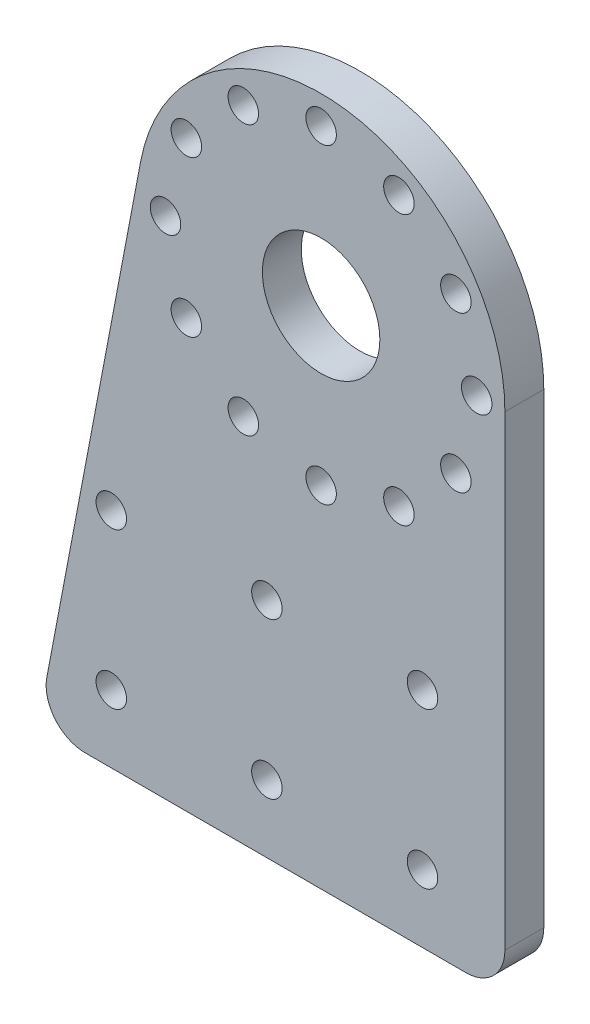
ISO-10303-21;
HEADER;
FILE_DESCRIPTION(('STEP AP214'),'2;1');
FILE_NAME('part.step','',(''),(''),'','','');
FILE_SCHEMA(('AUTOMOTIVE_DESIGN { 1 0 10303 214 1 1 1 1 }'));
ENDSEC;
DATA;
#1=APPLICATION_CONTEXT('core data for automotive mechanical design processes');
#2=APPLICATION_PROTOCOL_DEFINITION('international standard','automotive_design',2000,#1);
#3=PRODUCT_CONTEXT('',#1,'mechanical');
#4=PRODUCT('Part','Part','',(#3));
#5=PRODUCT_RELATED_PRODUCT_CATEGORY('part','',(#4));
#6=PRODUCT_DEFINITION_FORMATION('','',#4);
#7=PRODUCT_DEFINITION_CONTEXT('part definition',#1,'design');
#8=PRODUCT_DEFINITION('design','',#6,#7);
#9=PRODUCT_DEFINITION_SHAPE('','',#8);
#10=(LENGTH_UNIT() NAMED_UNIT(*) SI_UNIT(.MILLI.,.METRE.));
#11=(NAMED_UNIT(*) PLANE_ANGLE_UNIT() SI_UNIT($,.RADIAN.));
#12=(NAMED_UNIT(*) SI_UNIT($,.STERADIAN.) SOLID_ANGLE_UNIT());
#13=UNCERTAINTY_MEASURE_WITH_UNIT(LENGTH_MEASURE(1.E-05),#10,'distance_accuracy_value','');
#14=(GEOMETRIC_REPRESENTATION_CONTEXT(3) GLOBAL_UNCERTAINTY_ASSIGNED_CONTEXT((#13)) GLOBAL_UNIT_ASSIGNED_CONTEXT((#10,
#11,#12)) REPRESENTATION_CONTEXT('',''));
#15=CARTESIAN_POINT('',(0.,0.,0.));
#16=DIRECTION('',(0.,0.,1.));
#17=DIRECTION('',(1.,0.,0.));
#18=AXIS2_PLACEMENT_3D('',#15,#16,#17);
#19=CARTESIAN_POINT('',(514.35,135.2296,3.175));
#20=DIRECTION('',(0.,0.,-1.));
#21=DIRECTION('',(-1.,0.,0.));
#22=AXIS2_PLACEMENT_3D('',#19,#20,#21);
#23=CYLINDRICAL_SURFACE('',#22,2.48920000000001);
#24=CARTESIAN_POINT('',(514.35,135.2296,3.175));
#25=DIRECTION('',(0.,0.,1.));
#26=DIRECTION('',(1.,0.,0.));
#27=AXIS2_PLACEMENT_3D('',#24,#25,#26);
#28=CIRCLE('',#27,2.48920000000001);
#29=CARTESIAN_POINT('',(516.8392,135.2296,3.175));
#30=VERTEX_POINT('',#29);
#31=EDGE_CURVE('E44',#30,#30,#28,.T.);
#32=ORIENTED_EDGE('',*,*,#31,.T.);
#33=EDGE_LOOP('',(#32));
#34=FACE_BOUND('',#33,.T.);
#35=CARTESIAN_POINT('',(514.35,135.2296,-3.175));
#36=DIRECTION('',(0.,0.,1.));
#37=DIRECTION('',(1.,0.,0.));
#38=AXIS2_PLACEMENT_3D('',#35,#36,#37);
#39=CIRCLE('',#38,2.48920000000001);
#40=CARTESIAN_POINT('',(516.8392,135.2296,-3.175));
#41=VERTEX_POINT('',#40);
#42=EDGE_CURVE('E11',#41,#41,#39,.T.);
#43=ORIENTED_EDGE('',*,*,#42,.F.);
#44=EDGE_LOOP('',(#43));
#45=FACE_BOUND('',#44,.T.);
#46=ADVANCED_FACE('F37',(#34,#45),#23,.F.);
#47=CARTESIAN_POINT('',(514.35,109.8296,3.175));
#48=DIRECTION('',(0.,0.,-1.));
#49=DIRECTION('',(-1.,0.,0.));
#50=AXIS2_PLACEMENT_3D('',#47,#48,#49);
#51=CYLINDRICAL_SURFACE('',#50,2.48920000000001);
#52=CARTESIAN_POINT('',(514.35,109.8296,3.175));
#53=DIRECTION('',(0.,0.,1.));
#54=DIRECTION('',(1.,0.,0.));
#55=AXIS2_PLACEMENT_3D('',#52,#53,#54);
#56=CIRCLE('',#55,2.48920000000001);
#57=CARTESIAN_POINT('',(516.8392,109.8296,3.175));
#58=VERTEX_POINT('',#57);
#59=EDGE_CURVE('E147',#58,#58,#56,.T.);
#60=ORIENTED_EDGE('',*,*,#59,.T.);
#61=EDGE_LOOP('',(#60));
#62=FACE_BOUND('',#61,.T.);
#63=CARTESIAN_POINT('',(514.35,109.8296,-3.175));
#64=DIRECTION('',(0.,0.,1.));
#65=DIRECTION('',(1.,0.,0.));
#66=AXIS2_PLACEMENT_3D('',#63,#64,#65);
#67=CIRCLE('',#66,2.48920000000001);
#68=CARTESIAN_POINT('',(516.8392,109.8296,-3.175));
#69=VERTEX_POINT('',#68);
#70=EDGE_CURVE('E150',#69,#69,#67,.T.);
#71=ORIENTED_EDGE('',*,*,#70,.F.);
#72=EDGE_LOOP('',(#71));
#73=FACE_BOUND('',#72,.T.);
#74=ADVANCED_FACE('F170',(#62,#73),#51,.F.);
#75=CARTESIAN_POINT('',(488.95,135.2296,3.175));
#76=DIRECTION('',(0.,0.,-1.));
#77=DIRECTION('',(-1.,0.,0.));
#78=AXIS2_PLACEMENT_3D('',#75,#76,#77);
#79=CYLINDRICAL_SURFACE('',#78,2.48920000000001);
#80=CARTESIAN_POINT('',(488.95,135.2296,3.175));
#81=DIRECTION('',(0.,0.,1.));
#82=DIRECTION('',(1.,0.,0.));
#83=AXIS2_PLACEMENT_3D('',#80,#81,#82);
#84=CIRCLE('',#83,2.48920000000001);
#85=CARTESIAN_POINT('',(491.4392,135.2296,3.175));
#86=VERTEX_POINT('',#85);
#87=EDGE_CURVE('E141',#86,#86,#84,.T.);
#88=ORIENTED_EDGE('',*,*,#87,.T.);
#89=EDGE_LOOP('',(#88));
#90=FACE_BOUND('',#89,.T.);
#91=CARTESIAN_POINT('',(488.95,135.2296,-3.175));
#92=DIRECTION('',(0.,0.,1.));
#93=DIRECTION('',(1.,0.,0.));
#94=AXIS2_PLACEMENT_3D('',#91,#92,#93);
#95=CIRCLE('',#94,2.48920000000001);
#96=CARTESIAN_POINT('',(491.4392,135.2296,-3.175));
#97=VERTEX_POINT('',#96);
#98=EDGE_CURVE('E144',#97,#97,#95,.T.);
#99=ORIENTED_EDGE('',*,*,#98,.F.);
#100=EDGE_LOOP('',(#99));
#101=FACE_BOUND('',#100,.T.);
#102=ADVANCED_FACE('F167',(#90,#101),#79,.F.);
#103=CARTESIAN_POINT('',(488.95,109.8296,3.175));
#104=DIRECTION('',(0.,0.,-1.));
#105=DIRECTION('',(-1.,0.,0.));
#106=AXIS2_PLACEMENT_3D('',#103,#104,#105);
#107=CYLINDRICAL_SURFACE('',#106,2.48920000000001);
#108=CARTESIAN_POINT('',(488.95,109.8296,3.175));
#109=DIRECTION('',(0.,0.,1.));
#110=DIRECTION('',(1.,0.,0.));
#111=AXIS2_PLACEMENT_3D('',#108,#109,#110);
#112=CIRCLE('',#111,2.48920000000001);
#113=CARTESIAN_POINT('',(491.4392,109.8296,3.175));
#114=VERTEX_POINT('',#113);
#115=EDGE_CURVE('E135',#114,#114,#112,.T.);
#116=ORIENTED_EDGE('',*,*,#115,.T.);
#117=EDGE_LOOP('',(#116));
#118=FACE_BOUND('',#117,.T.);
#119=CARTESIAN_POINT('',(488.95,109.8296,-3.175));
#120=DIRECTION('',(0.,0.,1.));
#121=DIRECTION('',(1.,0.,0.));
#122=AXIS2_PLACEMENT_3D('',#119,#120,#121);
#123=CIRCLE('',#122,2.48920000000001);
#124=CARTESIAN_POINT('',(491.4392,109.8296,-3.175));
#125=VERTEX_POINT('',#124);
#126=EDGE_CURVE('E138',#125,#125,#123,.T.);
#127=ORIENTED_EDGE('',*,*,#126,.F.);
#128=EDGE_LOOP('',(#127));
#129=FACE_BOUND('',#128,.T.);
#130=ADVANCED_FACE('F160',(#118,#129),#107,.F.);
#131=CARTESIAN_POINT('',(497.799518014151,181.2671,3.175));
#132=DIRECTION('',(0.,0.,-1.));
#133=DIRECTION('',(-1.,0.,0.));
#134=AXIS2_PLACEMENT_3D('',#131,#132,#133);
#135=PLANE('',#134);
#136=ORIENTED_EDGE('',*,*,#59,.F.);
#137=EDGE_LOOP('',(#136));
#138=FACE_BOUND('',#137,.T.);
#139=ORIENTED_EDGE('',*,*,#31,.F.);
#140=EDGE_LOOP('',(#139));
#141=FACE_BOUND('',#140,.T.);
#142=ORIENTED_EDGE('',*,*,#115,.F.);
#143=EDGE_LOOP('',(#142));
#144=FACE_BOUND('',#143,.T.);
#145=ORIENTED_EDGE('',*,*,#87,.F.);
#146=EDGE_LOOP('',(#145));
#147=FACE_BOUND('',#146,.T.);
#148=DIRECTION('',(1.,0.,0.));
#149=VECTOR('',#148,1.);
#150=CARTESIAN_POINT('',(451.599517958151,98.806,3.175));
#151=LINE('',#150,#149);
#152=CARTESIAN_POINT('',(459.269250657975,98.806,3.175));
#153=VERTEX_POINT('',#152);
#154=CARTESIAN_POINT('',(521.449517958151,98.806,3.175));
#155=VERTEX_POINT('',#154);
#156=EDGE_CURVE('E98',#153,#155,#151,.T.);
#157=ORIENTED_EDGE('',*,*,#156,.T.);
#158=CARTESIAN_POINT('',(521.449517958151,105.156,3.175));
#159=DIRECTION('',(0.,0.,-1.));
#160=DIRECTION('',(-1.,0.,0.));
#161=AXIS2_PLACEMENT_3D('',#158,#159,#160);
#162=CIRCLE('',#161,6.35);
#163=CARTESIAN_POINT('',(527.799517958151,105.156,3.175));
#164=VERTEX_POINT('',#163);
#165=EDGE_CURVE('E132',#155,#164,#162,.F.);
#166=ORIENTED_EDGE('',*,*,#165,.T.);
#167=DIRECTION('',(0.,1.,0.));
#168=VECTOR('',#167,1.);
#169=CARTESIAN_POINT('',(527.799517958151,98.806,3.175));
#170=LINE('',#169,#168);
#171=CARTESIAN_POINT('',(527.799517958151,181.2671,3.175));
#172=VERTEX_POINT('',#171);
#173=EDGE_CURVE('E105',#164,#172,#170,.T.);
#174=ORIENTED_EDGE('',*,*,#173,.T.);
#175=CARTESIAN_POINT('',(497.799518014151,181.2671,3.175));
#176=DIRECTION('',(0.,0.,1.));
#177=DIRECTION('',(-1.,0.,0.));
#178=AXIS2_PLACEMENT_3D('',#175,#176,#177);
#179=CIRCLE('',#178,29.9999999439999);
#180=CARTESIAN_POINT('',(468.326520137148,186.865527706252,3.175));
#181=VERTEX_POINT('',#180);
#182=EDGE_CURVE('E99',#172,#181,#179,.T.);
#183=ORIENTED_EDGE('',*,*,#182,.T.);
#184=DIRECTION('',(-0.186614257223431,-0.982433264400665,0.));
#185=VECTOR('',#184,1.);
#186=CARTESIAN_POINT('',(451.599517958151,98.806,3.175));
#187=LINE('',#186,#185);
#188=CARTESIAN_POINT('',(453.030799429031,106.341000533369,3.175));
#189=VERTEX_POINT('',#188);
#190=EDGE_CURVE('E90',#181,#189,#187,.T.);
#191=ORIENTED_EDGE('',*,*,#190,.T.);
#192=CARTESIAN_POINT('',(459.269250657975,105.156,3.175));
#193=DIRECTION('',(0.,0.,-1.));
#194=DIRECTION('',(-1.,0.,0.));
#195=AXIS2_PLACEMENT_3D('',#192,#193,#194);
#196=CIRCLE('',#195,6.35);
#197=EDGE_CURVE('E130',#189,#153,#196,.F.);
#198=ORIENTED_EDGE('',*,*,#197,.T.);
#199=EDGE_LOOP('',(#157,#166,#174,#183,#191,#198));
#200=FACE_BOUND('',#199,.T.);
#201=CARTESIAN_POINT('',(497.799518014151,181.2671,3.175));
#202=DIRECTION('',(0.,0.,1.));
#203=DIRECTION('',(1.,0.,0.));
#204=AXIS2_PLACEMENT_3D('',#201,#202,#203);
#205=CIRCLE('',#204,9.5885);
#206=CARTESIAN_POINT('',(507.388018014151,181.2671,3.175));
#207=VERTEX_POINT('',#206);
#208=EDGE_CURVE('E297',#207,#207,#205,.T.);
#209=ORIENTED_EDGE('',*,*,#208,.F.);
#210=EDGE_LOOP('',(#209));
#211=FACE_BOUND('',#210,.T.);
#212=CARTESIAN_POINT('',(497.799518014151,206.6671,3.175));
#213=DIRECTION('',(0.,0.,1.));
#214=DIRECTION('',(1.,0.,0.));
#215=AXIS2_PLACEMENT_3D('',#212,#213,#214);
#216=CIRCLE('',#215,2.48919999999995);
#217=CARTESIAN_POINT('',(500.288718014151,206.6671,3.175));
#218=VERTEX_POINT('',#217);
#219=EDGE_CURVE('E293',#218,#218,#216,.T.);
#220=ORIENTED_EDGE('',*,*,#219,.F.);
#221=EDGE_LOOP('',(#220));
#222=FACE_BOUND('',#221,.T.);
#223=CARTESIAN_POINT('',(510.499518014151,203.264145256125,3.175));
#224=DIRECTION('',(0.,0.,1.));
#225=DIRECTION('',(1.,0.,0.));
#226=AXIS2_PLACEMENT_3D('',#223,#224,#225);
#227=CIRCLE('',#226,2.48919999999983);
#228=CARTESIAN_POINT('',(512.988718014151,203.264145256125,3.175));
#229=VERTEX_POINT('',#228);
#230=EDGE_CURVE('E289',#229,#229,#227,.T.);
#231=ORIENTED_EDGE('',*,*,#230,.F.);
#232=EDGE_LOOP('',(#231));
#233=FACE_BOUND('',#232,.T.);
#234=CARTESIAN_POINT('',(519.796563270276,193.9671,3.175));
#235=DIRECTION('',(0.,0.,1.));
#236=DIRECTION('',(1.,0.,0.));
#237=AXIS2_PLACEMENT_3D('',#234,#235,#236);
#238=CIRCLE('',#237,2.48919999999995);
#239=CARTESIAN_POINT('',(522.285763270276,193.9671,3.175));
#240=VERTEX_POINT('',#239);
#241=EDGE_CURVE('E285',#240,#240,#238,.T.);
#242=ORIENTED_EDGE('',*,*,#241,.F.);
#243=EDGE_LOOP('',(#242));
#244=FACE_BOUND('',#243,.T.);
#245=CARTESIAN_POINT('',(523.199518014151,181.2671,3.175));
#246=DIRECTION('',(0.,0.,1.));
#247=DIRECTION('',(1.,0.,0.));
#248=AXIS2_PLACEMENT_3D('',#245,#246,#247);
#249=CIRCLE('',#248,2.48919999999995);
#250=CARTESIAN_POINT('',(525.688718014151,181.2671,3.175));
#251=VERTEX_POINT('',#250);
#252=EDGE_CURVE('E281',#251,#251,#249,.T.);
#253=ORIENTED_EDGE('',*,*,#252,.F.);
#254=EDGE_LOOP('',(#253));
#255=FACE_BOUND('',#254,.T.);
#256=CARTESIAN_POINT('',(519.796563270276,168.5671,3.175));
#257=DIRECTION('',(0.,0.,1.));
#258=DIRECTION('',(1.,0.,0.));
#259=AXIS2_PLACEMENT_3D('',#256,#257,#258);
#260=CIRCLE('',#259,2.48919999999995);
#261=CARTESIAN_POINT('',(522.285763270276,168.5671,3.175));
#262=VERTEX_POINT('',#261);
#263=EDGE_CURVE('E277',#262,#262,#260,.T.);
#264=ORIENTED_EDGE('',*,*,#263,.F.);
#265=EDGE_LOOP('',(#264));
#266=FACE_BOUND('',#265,.T.);
#267=CARTESIAN_POINT('',(510.499518014151,159.270054743875,3.175));
#268=DIRECTION('',(0.,0.,1.));
#269=DIRECTION('',(1.,0.,0.));
#270=AXIS2_PLACEMENT_3D('',#267,#268,#269);
#271=CIRCLE('',#270,2.48920000000006);
#272=CARTESIAN_POINT('',(512.988718014151,159.270054743875,3.175));
#273=VERTEX_POINT('',#272);
#274=EDGE_CURVE('E273',#273,#273,#271,.T.);
#275=ORIENTED_EDGE('',*,*,#274,.F.);
#276=EDGE_LOOP('',(#275));
#277=FACE_BOUND('',#276,.T.);
#278=CARTESIAN_POINT('',(497.799518014151,155.8671,3.175));
#279=DIRECTION('',(0.,0.,1.));
#280=DIRECTION('',(1.,0.,0.));
#281=AXIS2_PLACEMENT_3D('',#278,#279,#280);
#282=CIRCLE('',#281,2.48919999999995);
#283=CARTESIAN_POINT('',(500.288718014151,155.8671,3.175));
#284=VERTEX_POINT('',#283);
#285=EDGE_CURVE('E269',#284,#284,#282,.T.);
#286=ORIENTED_EDGE('',*,*,#285,.F.);
#287=EDGE_LOOP('',(#286));
#288=FACE_BOUND('',#287,.T.);
#289=CARTESIAN_POINT('',(485.099518014151,159.270054743875,3.175));
#290=DIRECTION('',(0.,0.,1.));
#291=DIRECTION('',(1.,0.,0.));
#292=AXIS2_PLACEMENT_3D('',#289,#290,#291);
#293=CIRCLE('',#292,2.48920000000001);
#294=CARTESIAN_POINT('',(487.588718014151,159.270054743875,3.175));
#295=VERTEX_POINT('',#294);
#296=EDGE_CURVE('E265',#295,#295,#293,.T.);
#297=ORIENTED_EDGE('',*,*,#296,.F.);
#298=EDGE_LOOP('',(#297));
#299=FACE_BOUND('',#298,.T.);
#300=CARTESIAN_POINT('',(475.802472758027,168.5671,3.175));
#301=DIRECTION('',(0.,0.,1.));
#302=DIRECTION('',(1.,0.,0.));
#303=AXIS2_PLACEMENT_3D('',#300,#301,#302);
#304=CIRCLE('',#303,2.48919999999995);
#305=CARTESIAN_POINT('',(478.291672758027,168.5671,3.175));
#306=VERTEX_POINT('',#305);
#307=EDGE_CURVE('E261',#306,#306,#304,.T.);
#308=ORIENTED_EDGE('',*,*,#307,.F.);
#309=EDGE_LOOP('',(#308));
#310=FACE_BOUND('',#309,.T.);
#311=CARTESIAN_POINT('',(472.399518014151,181.2671,3.175));
#312=DIRECTION('',(0.,0.,1.));
#313=DIRECTION('',(1.,0.,0.));
#314=AXIS2_PLACEMENT_3D('',#311,#312,#313);
#315=CIRCLE('',#314,2.48919999999995);
#316=CARTESIAN_POINT('',(474.888718014151,181.2671,3.175));
#317=VERTEX_POINT('',#316);
#318=EDGE_CURVE('E257',#317,#317,#315,.T.);
#319=ORIENTED_EDGE('',*,*,#318,.F.);
#320=EDGE_LOOP('',(#319));
#321=FACE_BOUND('',#320,.T.);
#322=CARTESIAN_POINT('',(475.802472758026,193.9671,3.175));
#323=DIRECTION('',(0.,0.,1.));
#324=DIRECTION('',(1.,0.,0.));
#325=AXIS2_PLACEMENT_3D('',#322,#323,#324);
#326=CIRCLE('',#325,2.48920000000001);
#327=CARTESIAN_POINT('',(478.291672758026,193.9671,3.175));
#328=VERTEX_POINT('',#327);
#329=EDGE_CURVE('E253',#328,#328,#326,.T.);
#330=ORIENTED_EDGE('',*,*,#329,.F.);
#331=EDGE_LOOP('',(#330));
#332=FACE_BOUND('',#331,.T.);
#333=CARTESIAN_POINT('',(485.099518014151,203.264145256125,3.175));
#334=DIRECTION('',(0.,0.,1.));
#335=DIRECTION('',(1.,0.,0.));
#336=AXIS2_PLACEMENT_3D('',#333,#334,#335);
#337=CIRCLE('',#336,2.48919999999995);
#338=CARTESIAN_POINT('',(487.588718014151,203.264145256125,3.175));
#339=VERTEX_POINT('',#338);
#340=EDGE_CURVE('E249',#339,#339,#337,.T.);
#341=ORIENTED_EDGE('',*,*,#340,.F.);
#342=EDGE_LOOP('',(#341));
#343=FACE_BOUND('',#342,.T.);
#344=CARTESIAN_POINT('',(463.55,135.2296,3.175));
#345=DIRECTION('',(0.,0.,1.));
#346=DIRECTION('',(1.,0.,0.));
#347=AXIS2_PLACEMENT_3D('',#344,#345,#346);
#348=CIRCLE('',#347,2.48920000000001);
#349=CARTESIAN_POINT('',(466.0392,135.2296,3.175));
#350=VERTEX_POINT('',#349);
#351=EDGE_CURVE('E245',#350,#350,#348,.T.);
#352=ORIENTED_EDGE('',*,*,#351,.F.);
#353=EDGE_LOOP('',(#352));
#354=FACE_BOUND('',#353,.T.);
#355=CARTESIAN_POINT('',(463.55,109.8296,3.175));
#356=DIRECTION('',(0.,0.,1.));
#357=DIRECTION('',(1.,0.,0.));
#358=AXIS2_PLACEMENT_3D('',#355,#356,#357);
#359=CIRCLE('',#358,2.48920000000001);
#360=CARTESIAN_POINT('',(466.0392,109.8296,3.175));
#361=VERTEX_POINT('',#360);
#362=EDGE_CURVE('E240',#361,#361,#359,.T.);
#363=ORIENTED_EDGE('',*,*,#362,.F.);
#364=EDGE_LOOP('',(#363));
#365=FACE_BOUND('',#364,.T.);
#366=ADVANCED_FACE('F102',(#138,#141,#144,#147,#200,#211,#222,#233,#244,#255,#266,#277,#288,
#299,#310,#321,#332,#343,#354,#365),#135,.F.);
#367=CARTESIAN_POINT('',(497.799518014151,181.2671,-3.175));
#368=DIRECTION('',(0.,0.,-1.));
#369=DIRECTION('',(-1.,0.,0.));
#370=AXIS2_PLACEMENT_3D('',#367,#368,#369);
#371=PLANE('',#370);
#372=ORIENTED_EDGE('',*,*,#70,.T.);
#373=EDGE_LOOP('',(#372));
#374=FACE_BOUND('',#373,.T.);
#375=ORIENTED_EDGE('',*,*,#42,.T.);
#376=EDGE_LOOP('',(#375));
#377=FACE_BOUND('',#376,.T.);
#378=ORIENTED_EDGE('',*,*,#126,.T.);
#379=EDGE_LOOP('',(#378));
#380=FACE_BOUND('',#379,.T.);
#381=ORIENTED_EDGE('',*,*,#98,.T.);
#382=EDGE_LOOP('',(#381));
#383=FACE_BOUND('',#382,.T.);
#384=CARTESIAN_POINT('',(463.55,135.2296,-3.175));
#385=DIRECTION('',(0.,0.,1.));
#386=DIRECTION('',(1.,0.,0.));
#387=AXIS2_PLACEMENT_3D('',#384,#385,#386);
#388=CIRCLE('',#387,2.48920000000001);
#389=CARTESIAN_POINT('',(466.0392,135.2296,-3.175));
#390=VERTEX_POINT('',#389);
#391=EDGE_CURVE('E181',#390,#390,#388,.T.);
#392=ORIENTED_EDGE('',*,*,#391,.T.);
#393=EDGE_LOOP('',(#392));
#394=FACE_BOUND('',#393,.T.);
#395=CARTESIAN_POINT('',(475.802472758026,193.9671,-3.175));
#396=DIRECTION('',(0.,0.,1.));
#397=DIRECTION('',(1.,0.,0.));
#398=AXIS2_PLACEMENT_3D('',#395,#396,#397);
#399=CIRCLE('',#398,2.48920000000001);
#400=CARTESIAN_POINT('',(478.291672758026,193.9671,-3.175));
#401=VERTEX_POINT('',#400);
#402=EDGE_CURVE('E185',#401,#401,#399,.T.);
#403=ORIENTED_EDGE('',*,*,#402,.T.);
#404=EDGE_LOOP('',(#403));
#405=FACE_BOUND('',#404,.T.);
#406=CARTESIAN_POINT('',(475.802472758027,168.5671,-3.175));
#407=DIRECTION('',(0.,0.,1.));
#408=DIRECTION('',(1.,0.,0.));
#409=AXIS2_PLACEMENT_3D('',#406,#407,#408);
#410=CIRCLE('',#409,2.48919999999995);
#411=CARTESIAN_POINT('',(478.291672758027,168.5671,-3.175));
#412=VERTEX_POINT('',#411);
#413=EDGE_CURVE('E189',#412,#412,#410,.T.);
#414=ORIENTED_EDGE('',*,*,#413,.T.);
#415=EDGE_LOOP('',(#414));
#416=FACE_BOUND('',#415,.T.);
#417=CARTESIAN_POINT('',(497.799518014151,155.8671,-3.175));
#418=DIRECTION('',(0.,0.,1.));
#419=DIRECTION('',(1.,0.,0.));
#420=AXIS2_PLACEMENT_3D('',#417,#418,#419);
#421=CIRCLE('',#420,2.48919999999995);
#422=CARTESIAN_POINT('',(500.288718014151,155.8671,-3.175));
#423=VERTEX_POINT('',#422);
#424=EDGE_CURVE('E193',#423,#423,#421,.T.);
#425=ORIENTED_EDGE('',*,*,#424,.T.);
#426=EDGE_LOOP('',(#425));
#427=FACE_BOUND('',#426,.T.);
#428=CARTESIAN_POINT('',(519.796563270276,168.5671,-3.175));
#429=DIRECTION('',(0.,0.,1.));
#430=DIRECTION('',(1.,0.,0.));
#431=AXIS2_PLACEMENT_3D('',#428,#429,#430);
#432=CIRCLE('',#431,2.48919999999995);
#433=CARTESIAN_POINT('',(522.285763270276,168.5671,-3.175));
#434=VERTEX_POINT('',#433);
#435=EDGE_CURVE('E197',#434,#434,#432,.T.);
#436=ORIENTED_EDGE('',*,*,#435,.T.);
#437=EDGE_LOOP('',(#436));
#438=FACE_BOUND('',#437,.T.);
#439=CARTESIAN_POINT('',(519.796563270276,193.9671,-3.175));
#440=DIRECTION('',(0.,0.,1.));
#441=DIRECTION('',(1.,0.,0.));
#442=AXIS2_PLACEMENT_3D('',#439,#440,#441);
#443=CIRCLE('',#442,2.48919999999995);
#444=CARTESIAN_POINT('',(522.285763270276,193.9671,-3.175));
#445=VERTEX_POINT('',#444);
#446=EDGE_CURVE('E201',#445,#445,#443,.T.);
#447=ORIENTED_EDGE('',*,*,#446,.T.);
#448=EDGE_LOOP('',(#447));
#449=FACE_BOUND('',#448,.T.);
#450=CARTESIAN_POINT('',(497.799518014151,206.6671,-3.175));
#451=DIRECTION('',(0.,0.,1.));
#452=DIRECTION('',(1.,0.,0.));
#453=AXIS2_PLACEMENT_3D('',#450,#451,#452);
#454=CIRCLE('',#453,2.48919999999995);
#455=CARTESIAN_POINT('',(500.288718014151,206.6671,-3.175));
#456=VERTEX_POINT('',#455);
#457=EDGE_CURVE('E205',#456,#456,#454,.T.);
#458=ORIENTED_EDGE('',*,*,#457,.T.);
#459=EDGE_LOOP('',(#458));
#460=FACE_BOUND('',#459,.T.);
#461=DIRECTION('',(0.,1.,0.));
#462=VECTOR('',#461,1.);
#463=CARTESIAN_POINT('',(527.799517958151,98.806,-3.175));
#464=LINE('',#463,#462);
#465=CARTESIAN_POINT('',(527.799517958151,105.156,-3.175));
#466=VERTEX_POINT('',#465);
#467=CARTESIAN_POINT('',(527.799517958151,181.2671,-3.175));
#468=VERTEX_POINT('',#467);
#469=EDGE_CURVE('E109',#466,#468,#464,.T.);
#470=ORIENTED_EDGE('',*,*,#469,.F.);
#471=CARTESIAN_POINT('',(521.449517958151,105.156,-3.175));
#472=DIRECTION('',(0.,0.,-1.));
#473=DIRECTION('',(-1.,0.,0.));
#474=AXIS2_PLACEMENT_3D('',#471,#472,#473);
#475=CIRCLE('',#474,6.35);
#476=CARTESIAN_POINT('',(521.449517958151,98.806,-3.175));
#477=VERTEX_POINT('',#476);
#478=EDGE_CURVE('E124',#466,#477,#475,.T.);
#479=ORIENTED_EDGE('',*,*,#478,.T.);
#480=DIRECTION('',(1.,0.,0.));
#481=VECTOR('',#480,1.);
#482=CARTESIAN_POINT('',(451.599517958151,98.806,-3.175));
#483=LINE('',#482,#481);
#484=CARTESIAN_POINT('',(459.269250657975,98.806,-3.175));
#485=VERTEX_POINT('',#484);
#486=EDGE_CURVE('E306',#485,#477,#483,.T.);
#487=ORIENTED_EDGE('',*,*,#486,.F.);
#488=CARTESIAN_POINT('',(459.269250657975,105.156,-3.175));
#489=DIRECTION('',(0.,0.,-1.));
#490=DIRECTION('',(-1.,0.,0.));
#491=AXIS2_PLACEMENT_3D('',#488,#489,#490);
#492=CIRCLE('',#491,6.35);
#493=CARTESIAN_POINT('',(453.030799429031,106.341000533369,-3.175));
#494=VERTEX_POINT('',#493);
#495=EDGE_CURVE('E118',#485,#494,#492,.T.);
#496=ORIENTED_EDGE('',*,*,#495,.T.);
#497=DIRECTION('',(-0.186614257223431,-0.982433264400665,0.));
#498=VECTOR('',#497,1.);
#499=CARTESIAN_POINT('',(451.599517958151,98.806,-3.175));
#500=LINE('',#499,#498);
#501=CARTESIAN_POINT('',(468.326520137148,186.865527706252,-3.175));
#502=VERTEX_POINT('',#501);
#503=EDGE_CURVE('E304',#502,#494,#500,.T.);
#504=ORIENTED_EDGE('',*,*,#503,.F.);
#505=CARTESIAN_POINT('',(497.799518014151,181.2671,-3.175));
#506=DIRECTION('',(0.,0.,1.));
#507=DIRECTION('',(-1.,0.,0.));
#508=AXIS2_PLACEMENT_3D('',#505,#506,#507);
#509=CIRCLE('',#508,29.9999999439999);
#510=EDGE_CURVE('E113',#468,#502,#509,.T.);
#511=ORIENTED_EDGE('',*,*,#510,.F.);
#512=EDGE_LOOP('',(#470,#479,#487,#496,#504,#511));
#513=FACE_BOUND('',#512,.T.);
#514=CARTESIAN_POINT('',(497.799518014151,181.2671,-3.175));
#515=DIRECTION('',(0.,0.,1.));
#516=DIRECTION('',(1.,0.,0.));
#517=AXIS2_PLACEMENT_3D('',#514,#515,#516);
#518=CIRCLE('',#517,9.5885);
#519=CARTESIAN_POINT('',(507.388018014151,181.2671,-3.175));
#520=VERTEX_POINT('',#519);
#521=EDGE_CURVE('E211',#520,#520,#518,.T.);
#522=ORIENTED_EDGE('',*,*,#521,.T.);
#523=EDGE_LOOP('',(#522));
#524=FACE_BOUND('',#523,.T.);
#525=CARTESIAN_POINT('',(510.499518014151,203.264145256125,-3.175));
#526=DIRECTION('',(0.,0.,1.));
#527=DIRECTION('',(1.,0.,0.));
#528=AXIS2_PLACEMENT_3D('',#525,#526,#527);
#529=CIRCLE('',#528,2.48919999999983);
#530=CARTESIAN_POINT('',(512.988718014151,203.264145256125,-3.175));
#531=VERTEX_POINT('',#530);
#532=EDGE_CURVE('E215',#531,#531,#529,.T.);
#533=ORIENTED_EDGE('',*,*,#532,.T.);
#534=EDGE_LOOP('',(#533));
#535=FACE_BOUND('',#534,.T.);
#536=CARTESIAN_POINT('',(523.199518014151,181.2671,-3.175));
#537=DIRECTION('',(0.,0.,1.));
#538=DIRECTION('',(1.,0.,0.));
#539=AXIS2_PLACEMENT_3D('',#536,#537,#538);
#540=CIRCLE('',#539,2.48919999999995);
#541=CARTESIAN_POINT('',(525.688718014151,181.2671,-3.175));
#542=VERTEX_POINT('',#541);
#543=EDGE_CURVE('E219',#542,#542,#540,.T.);
#544=ORIENTED_EDGE('',*,*,#543,.T.);
#545=EDGE_LOOP('',(#544));
#546=FACE_BOUND('',#545,.T.);
#547=CARTESIAN_POINT('',(510.499518014151,159.270054743875,-3.175));
#548=DIRECTION('',(0.,0.,1.));
#549=DIRECTION('',(1.,0.,0.));
#550=AXIS2_PLACEMENT_3D('',#547,#548,#549);
#551=CIRCLE('',#550,2.48920000000006);
#552=CARTESIAN_POINT('',(512.988718014151,159.270054743875,-3.175));
#553=VERTEX_POINT('',#552);
#554=EDGE_CURVE('E223',#553,#553,#551,.T.);
#555=ORIENTED_EDGE('',*,*,#554,.T.);
#556=EDGE_LOOP('',(#555));
#557=FACE_BOUND('',#556,.T.);
#558=CARTESIAN_POINT('',(485.099518014151,159.270054743875,-3.175));
#559=DIRECTION('',(0.,0.,1.));
#560=DIRECTION('',(1.,0.,0.));
#561=AXIS2_PLACEMENT_3D('',#558,#559,#560);
#562=CIRCLE('',#561,2.48920000000001);
#563=CARTESIAN_POINT('',(487.588718014151,159.270054743875,-3.175));
#564=VERTEX_POINT('',#563);
#565=EDGE_CURVE('E227',#564,#564,#562,.T.);
#566=ORIENTED_EDGE('',*,*,#565,.T.);
#567=EDGE_LOOP('',(#566));
#568=FACE_BOUND('',#567,.T.);
#569=CARTESIAN_POINT('',(472.399518014151,181.2671,-3.175));
#570=DIRECTION('',(0.,0.,1.));
#571=DIRECTION('',(1.,0.,0.));
#572=AXIS2_PLACEMENT_3D('',#569,#570,#571);
#573=CIRCLE('',#572,2.48919999999995);
#574=CARTESIAN_POINT('',(474.888718014151,181.2671,-3.175));
#575=VERTEX_POINT('',#574);
#576=EDGE_CURVE('E231',#575,#575,#573,.T.);
#577=ORIENTED_EDGE('',*,*,#576,.T.);
#578=EDGE_LOOP('',(#577));
#579=FACE_BOUND('',#578,.T.);
#580=CARTESIAN_POINT('',(485.099518014151,203.264145256125,-3.175));
#581=DIRECTION('',(0.,0.,1.));
#582=DIRECTION('',(1.,0.,0.));
#583=AXIS2_PLACEMENT_3D('',#580,#581,#582);
#584=CIRCLE('',#583,2.48919999999995);
#585=CARTESIAN_POINT('',(487.588718014151,203.264145256125,-3.175));
#586=VERTEX_POINT('',#585);
#587=EDGE_CURVE('E235',#586,#586,#584,.T.);
#588=ORIENTED_EDGE('',*,*,#587,.T.);
#589=EDGE_LOOP('',(#588));
#590=FACE_BOUND('',#589,.T.);
#591=CARTESIAN_POINT('',(463.55,109.8296,-3.175));
#592=DIRECTION('',(0.,0.,1.));
#593=DIRECTION('',(1.,0.,0.));
#594=AXIS2_PLACEMENT_3D('',#591,#592,#593);
#595=CIRCLE('',#594,2.48920000000001);
#596=CARTESIAN_POINT('',(466.0392,109.8296,-3.175));
#597=VERTEX_POINT('',#596);
#598=EDGE_CURVE('E238',#597,#597,#595,.T.);
#599=ORIENTED_EDGE('',*,*,#598,.T.);
#600=EDGE_LOOP('',(#599));
#601=FACE_BOUND('',#600,.T.);
#602=ADVANCED_FACE('F159',(#374,#377,#380,#383,#394,#405,#416,#427,#438,#449,#460,#513,#524,
#535,#546,#557,#568,#579,#590,#601),#371,.T.);
#603=CARTESIAN_POINT('',(497.799518014151,181.2671,3.175));
#604=DIRECTION('',(0.,0.,-1.));
#605=DIRECTION('',(-1.,0.,0.));
#606=AXIS2_PLACEMENT_3D('',#603,#604,#605);
#607=CYLINDRICAL_SURFACE('',#606,29.9999999439999);
#608=ORIENTED_EDGE('',*,*,#510,.T.);
#609=DIRECTION('',(0.,0.,-1.));
#610=VECTOR('',#609,1.);
#611=CARTESIAN_POINT('',(468.326520137148,186.865527706252,3.175));
#612=LINE('',#611,#610);
#613=EDGE_CURVE('E94',#181,#502,#612,.T.);
#614=ORIENTED_EDGE('',*,*,#613,.F.);
#615=ORIENTED_EDGE('',*,*,#182,.F.);
#616=DIRECTION('',(0.,0.,-1.));
#617=VECTOR('',#616,1.);
#618=CARTESIAN_POINT('',(527.799517958151,181.2671,3.175));
#619=LINE('',#618,#617);
#620=EDGE_CURVE('E115',#172,#468,#619,.T.);
#621=ORIENTED_EDGE('',*,*,#620,.T.);
#622=EDGE_LOOP('',(#608,#614,#615,#621));
#623=FACE_BOUND('',#622,.T.);
#624=ADVANCED_FACE('F111',(#623),#607,.T.);
#625=CARTESIAN_POINT('',(451.599517958151,98.806,3.175));
#626=DIRECTION('',(0.982433264400665,-0.186614257223431,0.));
#627=DIRECTION('',(0.186614257223431,0.982433264400665,0.));
#628=AXIS2_PLACEMENT_3D('',#625,#626,#627);
#629=PLANE('',#628);
#630=ORIENTED_EDGE('',*,*,#503,.T.);
#631=DIRECTION('',(0.,0.,-1.));
#632=VECTOR('',#631,1.);
#633=CARTESIAN_POINT('',(453.030799429031,106.341000533369,3.175));
#634=LINE('',#633,#632);
#635=EDGE_CURVE('E51',#494,#189,#634,.F.);
#636=ORIENTED_EDGE('',*,*,#635,.T.);
#637=ORIENTED_EDGE('',*,*,#190,.F.);
#638=ORIENTED_EDGE('',*,*,#613,.T.);
#639=EDGE_LOOP('',(#630,#636,#637,#638));
#640=FACE_BOUND('',#639,.T.);
#641=ADVANCED_FACE('F92',(#640),#629,.F.);
#642=CARTESIAN_POINT('',(451.599517958151,98.806,3.175));
#643=DIRECTION('',(0.,1.,0.));
#644=DIRECTION('',(0.,0.,1.));
#645=AXIS2_PLACEMENT_3D('',#642,#643,#644);
#646=PLANE('',#645);
#647=ORIENTED_EDGE('',*,*,#486,.T.);
#648=DIRECTION('',(0.,0.,-1.));
#649=VECTOR('',#648,1.);
#650=CARTESIAN_POINT('',(521.449517958151,98.806,3.175));
#651=LINE('',#650,#649);
#652=EDGE_CURVE('E59',#477,#155,#651,.F.);
#653=ORIENTED_EDGE('',*,*,#652,.T.);
#654=ORIENTED_EDGE('',*,*,#156,.F.);
#655=DIRECTION('',(0.,0.,-1.));
#656=VECTOR('',#655,1.);
#657=CARTESIAN_POINT('',(459.269250657975,98.806,3.175));
#658=LINE('',#657,#656);
#659=EDGE_CURVE('E126',#153,#485,#658,.T.);
#660=ORIENTED_EDGE('',*,*,#659,.T.);
#661=EDGE_LOOP('',(#647,#653,#654,#660));
#662=FACE_BOUND('',#661,.T.);
#663=ADVANCED_FACE('F315',(#662),#646,.F.);
#664=CARTESIAN_POINT('',(527.799517958151,98.806,3.175));
#665=DIRECTION('',(-1.,0.,0.));
#666=DIRECTION('',(0.,-1.,0.));
#667=AXIS2_PLACEMENT_3D('',#664,#665,#666);
#668=PLANE('',#667);
#669=ORIENTED_EDGE('',*,*,#173,.F.);
#670=DIRECTION('',(0.,0.,-1.));
#671=VECTOR('',#670,1.);
#672=CARTESIAN_POINT('',(527.799517958151,105.156,3.175));
#673=LINE('',#672,#671);
#674=EDGE_CURVE('E114',#164,#466,#673,.T.);
#675=ORIENTED_EDGE('',*,*,#674,.T.);
#676=ORIENTED_EDGE('',*,*,#469,.T.);
#677=ORIENTED_EDGE('',*,*,#620,.F.);
#678=EDGE_LOOP('',(#669,#675,#676,#677));
#679=FACE_BOUND('',#678,.T.);
#680=ADVANCED_FACE('F308',(#679),#668,.F.);
#681=CARTESIAN_POINT('',(497.799518014151,181.2671,3.175));
#682=DIRECTION('',(0.,0.,-1.));
#683=DIRECTION('',(-1.,0.,0.));
#684=AXIS2_PLACEMENT_3D('',#681,#682,#683);
#685=CYLINDRICAL_SURFACE('',#684,9.5885);
#686=ORIENTED_EDGE('',*,*,#208,.T.);
#687=EDGE_LOOP('',(#686));
#688=FACE_BOUND('',#687,.T.);
#689=ORIENTED_EDGE('',*,*,#521,.F.);
#690=EDGE_LOOP('',(#689));
#691=FACE_BOUND('',#690,.T.);
#692=ADVANCED_FACE('F381',(#688,#691),#685,.F.);
#693=CARTESIAN_POINT('',(497.799518014151,206.6671,3.175));
#694=DIRECTION('',(0.,0.,-1.));
#695=DIRECTION('',(-1.,0.,0.));
#696=AXIS2_PLACEMENT_3D('',#693,#694,#695);
#697=CYLINDRICAL_SURFACE('',#696,2.48919999999995);
#698=ORIENTED_EDGE('',*,*,#219,.T.);
#699=EDGE_LOOP('',(#698));
#700=FACE_BOUND('',#699,.T.);
#701=ORIENTED_EDGE('',*,*,#457,.F.);
#702=EDGE_LOOP('',(#701));
#703=FACE_BOUND('',#702,.T.);
#704=ADVANCED_FACE('F387',(#700,#703),#697,.F.);
#705=CARTESIAN_POINT('',(510.499518014151,203.264145256125,3.175));
#706=DIRECTION('',(0.,0.,-1.));
#707=DIRECTION('',(-1.,0.,0.));
#708=AXIS2_PLACEMENT_3D('',#705,#706,#707);
#709=CYLINDRICAL_SURFACE('',#708,2.48919999999983);
#710=ORIENTED_EDGE('',*,*,#230,.T.);
#711=EDGE_LOOP('',(#710));
#712=FACE_BOUND('',#711,.T.);
#713=ORIENTED_EDGE('',*,*,#532,.F.);
#714=EDGE_LOOP('',(#713));
#715=FACE_BOUND('',#714,.T.);
#716=ADVANCED_FACE('F395',(#712,#715),#709,.F.);
#717=CARTESIAN_POINT('',(519.796563270276,193.9671,3.175));
#718=DIRECTION('',(0.,0.,-1.));
#719=DIRECTION('',(-1.,0.,0.));
#720=AXIS2_PLACEMENT_3D('',#717,#718,#719);
#721=CYLINDRICAL_SURFACE('',#720,2.48919999999995);
#722=ORIENTED_EDGE('',*,*,#241,.T.);
#723=EDGE_LOOP('',(#722));
#724=FACE_BOUND('',#723,.T.);
#725=ORIENTED_EDGE('',*,*,#446,.F.);
#726=EDGE_LOOP('',(#725));
#727=FACE_BOUND('',#726,.T.);
#728=ADVANCED_FACE('F403',(#724,#727),#721,.F.);
#729=CARTESIAN_POINT('',(523.199518014151,181.2671,3.175));
#730=DIRECTION('',(0.,0.,-1.));
#731=DIRECTION('',(-1.,0.,0.));
#732=AXIS2_PLACEMENT_3D('',#729,#730,#731);
#733=CYLINDRICAL_SURFACE('',#732,2.48919999999995);
#734=ORIENTED_EDGE('',*,*,#252,.T.);
#735=EDGE_LOOP('',(#734));
#736=FACE_BOUND('',#735,.T.);
#737=ORIENTED_EDGE('',*,*,#543,.F.);
#738=EDGE_LOOP('',(#737));
#739=FACE_BOUND('',#738,.T.);
#740=ADVANCED_FACE('F411',(#736,#739),#733,.F.);
#741=CARTESIAN_POINT('',(519.796563270276,168.5671,3.175));
#742=DIRECTION('',(0.,0.,-1.));
#743=DIRECTION('',(-1.,0.,0.));
#744=AXIS2_PLACEMENT_3D('',#741,#742,#743);
#745=CYLINDRICAL_SURFACE('',#744,2.48919999999995);
#746=ORIENTED_EDGE('',*,*,#263,.T.);
#747=EDGE_LOOP('',(#746));
#748=FACE_BOUND('',#747,.T.);
#749=ORIENTED_EDGE('',*,*,#435,.F.);
#750=EDGE_LOOP('',(#749));
#751=FACE_BOUND('',#750,.T.);
#752=ADVANCED_FACE('F419',(#748,#751),#745,.F.);
#753=CARTESIAN_POINT('',(510.499518014151,159.270054743875,3.175));
#754=DIRECTION('',(0.,0.,-1.));
#755=DIRECTION('',(-1.,0.,0.));
#756=AXIS2_PLACEMENT_3D('',#753,#754,#755);
#757=CYLINDRICAL_SURFACE('',#756,2.48920000000006);
#758=ORIENTED_EDGE('',*,*,#274,.T.);
#759=EDGE_LOOP('',(#758));
#760=FACE_BOUND('',#759,.T.);
#761=ORIENTED_EDGE('',*,*,#554,.F.);
#762=EDGE_LOOP('',(#761));
#763=FACE_BOUND('',#762,.T.);
#764=ADVANCED_FACE('F427',(#760,#763),#757,.F.);
#765=CARTESIAN_POINT('',(497.799518014151,155.8671,3.175));
#766=DIRECTION('',(0.,0.,-1.));
#767=DIRECTION('',(-1.,0.,0.));
#768=AXIS2_PLACEMENT_3D('',#765,#766,#767);
#769=CYLINDRICAL_SURFACE('',#768,2.48919999999995);
#770=ORIENTED_EDGE('',*,*,#285,.T.);
#771=EDGE_LOOP('',(#770));
#772=FACE_BOUND('',#771,.T.);
#773=ORIENTED_EDGE('',*,*,#424,.F.);
#774=EDGE_LOOP('',(#773));
#775=FACE_BOUND('',#774,.T.);
#776=ADVANCED_FACE('F435',(#772,#775),#769,.F.);
#777=CARTESIAN_POINT('',(485.099518014151,159.270054743875,3.175));
#778=DIRECTION('',(0.,0.,-1.));
#779=DIRECTION('',(-1.,0.,0.));
#780=AXIS2_PLACEMENT_3D('',#777,#778,#779);
#781=CYLINDRICAL_SURFACE('',#780,2.48920000000001);
#782=ORIENTED_EDGE('',*,*,#296,.T.);
#783=EDGE_LOOP('',(#782));
#784=FACE_BOUND('',#783,.T.);
#785=ORIENTED_EDGE('',*,*,#565,.F.);
#786=EDGE_LOOP('',(#785));
#787=FACE_BOUND('',#786,.T.);
#788=ADVANCED_FACE('F443',(#784,#787),#781,.F.);
#789=CARTESIAN_POINT('',(475.802472758027,168.5671,3.175));
#790=DIRECTION('',(0.,0.,-1.));
#791=DIRECTION('',(-1.,0.,0.));
#792=AXIS2_PLACEMENT_3D('',#789,#790,#791);
#793=CYLINDRICAL_SURFACE('',#792,2.48919999999995);
#794=ORIENTED_EDGE('',*,*,#307,.T.);
#795=EDGE_LOOP('',(#794));
#796=FACE_BOUND('',#795,.T.);
#797=ORIENTED_EDGE('',*,*,#413,.F.);
#798=EDGE_LOOP('',(#797));
#799=FACE_BOUND('',#798,.T.);
#800=ADVANCED_FACE('F451',(#796,#799),#793,.F.);
#801=CARTESIAN_POINT('',(472.399518014151,181.2671,3.175));
#802=DIRECTION('',(0.,0.,-1.));
#803=DIRECTION('',(-1.,0.,0.));
#804=AXIS2_PLACEMENT_3D('',#801,#802,#803);
#805=CYLINDRICAL_SURFACE('',#804,2.48919999999995);
#806=ORIENTED_EDGE('',*,*,#318,.T.);
#807=EDGE_LOOP('',(#806));
#808=FACE_BOUND('',#807,.T.);
#809=ORIENTED_EDGE('',*,*,#576,.F.);
#810=EDGE_LOOP('',(#809));
#811=FACE_BOUND('',#810,.T.);
#812=ADVANCED_FACE('F459',(#808,#811),#805,.F.);
#813=CARTESIAN_POINT('',(475.802472758026,193.9671,3.175));
#814=DIRECTION('',(0.,0.,-1.));
#815=DIRECTION('',(-1.,0.,0.));
#816=AXIS2_PLACEMENT_3D('',#813,#814,#815);
#817=CYLINDRICAL_SURFACE('',#816,2.48920000000001);
#818=ORIENTED_EDGE('',*,*,#329,.T.);
#819=EDGE_LOOP('',(#818));
#820=FACE_BOUND('',#819,.T.);
#821=ORIENTED_EDGE('',*,*,#402,.F.);
#822=EDGE_LOOP('',(#821));
#823=FACE_BOUND('',#822,.T.);
#824=ADVANCED_FACE('F467',(#820,#823),#817,.F.);
#825=CARTESIAN_POINT('',(485.099518014151,203.264145256125,3.175));
#826=DIRECTION('',(0.,0.,-1.));
#827=DIRECTION('',(-1.,0.,0.));
#828=AXIS2_PLACEMENT_3D('',#825,#826,#827);
#829=CYLINDRICAL_SURFACE('',#828,2.48919999999995);
#830=ORIENTED_EDGE('',*,*,#340,.T.);
#831=EDGE_LOOP('',(#830));
#832=FACE_BOUND('',#831,.T.);
#833=ORIENTED_EDGE('',*,*,#587,.F.);
#834=EDGE_LOOP('',(#833));
#835=FACE_BOUND('',#834,.T.);
#836=ADVANCED_FACE('F475',(#832,#835),#829,.F.);
#837=CARTESIAN_POINT('',(463.55,135.2296,3.175));
#838=DIRECTION('',(0.,0.,-1.));
#839=DIRECTION('',(-1.,0.,0.));
#840=AXIS2_PLACEMENT_3D('',#837,#838,#839);
#841=CYLINDRICAL_SURFACE('',#840,2.48920000000001);
#842=ORIENTED_EDGE('',*,*,#351,.T.);
#843=EDGE_LOOP('',(#842));
#844=FACE_BOUND('',#843,.T.);
#845=ORIENTED_EDGE('',*,*,#391,.F.);
#846=EDGE_LOOP('',(#845));
#847=FACE_BOUND('',#846,.T.);
#848=ADVANCED_FACE('F326',(#844,#847),#841,.F.);
#849=CARTESIAN_POINT('',(463.55,109.8296,3.175));
#850=DIRECTION('',(0.,0.,-1.));
#851=DIRECTION('',(-1.,0.,0.));
#852=AXIS2_PLACEMENT_3D('',#849,#850,#851);
#853=CYLINDRICAL_SURFACE('',#852,2.48920000000001);
#854=ORIENTED_EDGE('',*,*,#362,.T.);
#855=EDGE_LOOP('',(#854));
#856=FACE_BOUND('',#855,.T.);
#857=ORIENTED_EDGE('',*,*,#598,.F.);
#858=EDGE_LOOP('',(#857));
#859=FACE_BOUND('',#858,.T.);
#860=ADVANCED_FACE('F319',(#856,#859),#853,.F.);
#861=CARTESIAN_POINT('',(521.449517958151,105.156,3.175));
#862=DIRECTION('',(0.,0.,-1.));
#863=DIRECTION('',(-1.,0.,0.));
#864=AXIS2_PLACEMENT_3D('',#861,#862,#863);
#865=CYLINDRICAL_SURFACE('',#864,6.35);
#866=ORIENTED_EDGE('',*,*,#165,.F.);
#867=ORIENTED_EDGE('',*,*,#652,.F.);
#868=ORIENTED_EDGE('',*,*,#478,.F.);
#869=ORIENTED_EDGE('',*,*,#674,.F.);
#870=EDGE_LOOP('',(#866,#867,#868,#869));
#871=FACE_BOUND('',#870,.T.);
#872=ADVANCED_FACE('F317',(#871),#865,.T.);
#873=CARTESIAN_POINT('',(459.269250657975,105.156,3.175));
#874=DIRECTION('',(0.,0.,-1.));
#875=DIRECTION('',(-1.,0.,0.));
#876=AXIS2_PLACEMENT_3D('',#873,#874,#875);
#877=CYLINDRICAL_SURFACE('',#876,6.35);
#878=ORIENTED_EDGE('',*,*,#197,.F.);
#879=ORIENTED_EDGE('',*,*,#635,.F.);
#880=ORIENTED_EDGE('',*,*,#495,.F.);
#881=ORIENTED_EDGE('',*,*,#659,.F.);
#882=EDGE_LOOP('',(#878,#879,#880,#881));
#883=FACE_BOUND('',#882,.T.);
#884=ADVANCED_FACE('F312',(#883),#877,.T.);
#885=CLOSED_SHELL('',(#46,#74,#102,#130,#366,#602,#624,#641,#663,#680,#692,#704,#716,#728,#740,
#752,#764,#776,#788,#800,#812,#824,#836,#848,#860,#872,#884));
#886=MANIFOLD_SOLID_BREP('B2',#885);
#887=ADVANCED_BREP_SHAPE_REPRESENTATION('',(#18,#886),#14);
#888=SHAPE_DEFINITION_REPRESENTATION(#9,#887);
ENDSEC;
END-ISO-10303-21;
